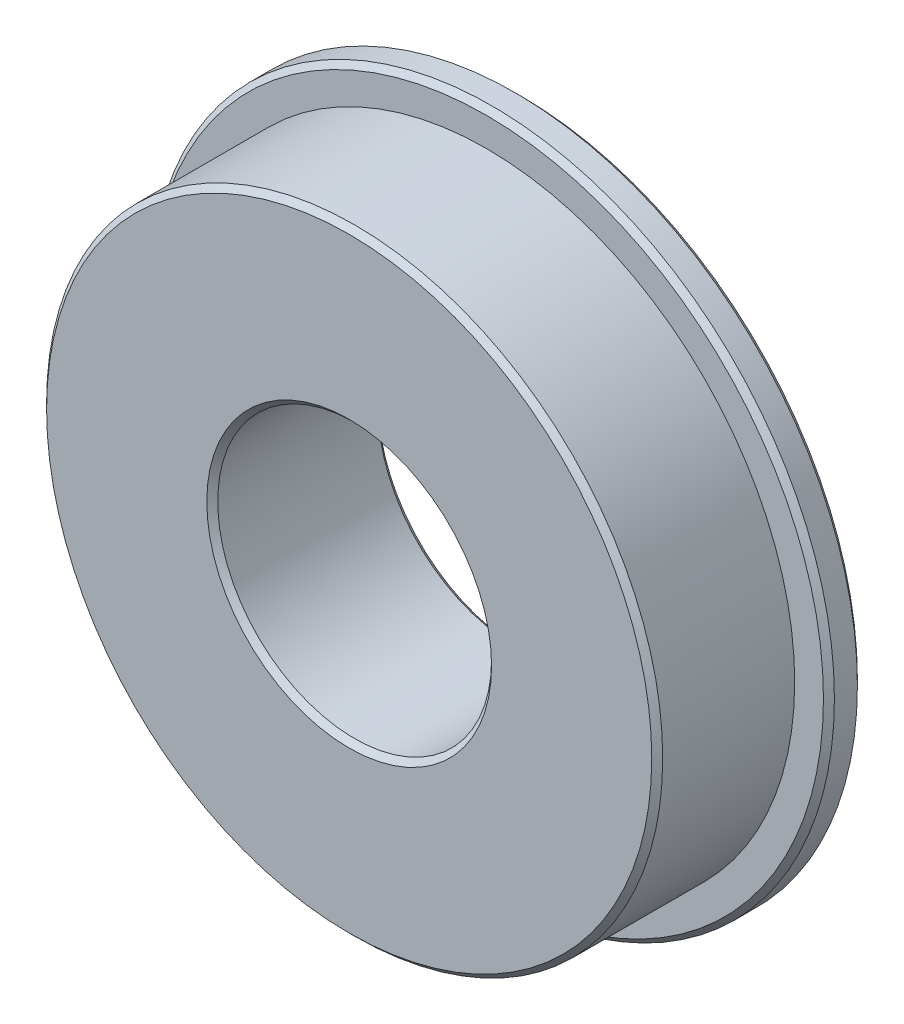
ISO-10303-21;
HEADER;
FILE_DESCRIPTION(('STEP AP214'),'2;1');
FILE_NAME('part.step','',(''),(''),'','','');
FILE_SCHEMA(('AUTOMOTIVE_DESIGN { 1 0 10303 214 1 1 1 1 }'));
ENDSEC;
DATA;
#1=APPLICATION_CONTEXT('core data for automotive mechanical design processes');
#2=APPLICATION_PROTOCOL_DEFINITION('international standard','automotive_design',2000,#1);
#3=PRODUCT_CONTEXT('',#1,'mechanical');
#4=PRODUCT('Part','Part','',(#3));
#5=PRODUCT_RELATED_PRODUCT_CATEGORY('part','',(#4));
#6=PRODUCT_DEFINITION_FORMATION('','',#4);
#7=PRODUCT_DEFINITION_CONTEXT('part definition',#1,'design');
#8=PRODUCT_DEFINITION('design','',#6,#7);
#9=PRODUCT_DEFINITION_SHAPE('','',#8);
#10=(LENGTH_UNIT() NAMED_UNIT(*) SI_UNIT(.MILLI.,.METRE.));
#11=(NAMED_UNIT(*) PLANE_ANGLE_UNIT() SI_UNIT($,.RADIAN.));
#12=(NAMED_UNIT(*) SI_UNIT($,.STERADIAN.) SOLID_ANGLE_UNIT());
#13=UNCERTAINTY_MEASURE_WITH_UNIT(LENGTH_MEASURE(1.E-05),#10,'distance_accuracy_value','');
#14=(GEOMETRIC_REPRESENTATION_CONTEXT(3) GLOBAL_UNCERTAINTY_ASSIGNED_CONTEXT((#13)) GLOBAL_UNIT_ASSIGNED_CONTEXT((#10,
#11,#12)) REPRESENTATION_CONTEXT('',''));
#15=CARTESIAN_POINT('',(0.,0.,0.));
#16=DIRECTION('',(0.,0.,1.));
#17=DIRECTION('',(1.,0.,0.));
#18=AXIS2_PLACEMENT_3D('',#15,#16,#17);
#19=CARTESIAN_POINT('',(-8.86153846153846,6.04195804195805,-3.41629999999996));
#20=DIRECTION('',(0.,0.,-1.));
#21=DIRECTION('',(0.,-1.,0.));
#22=AXIS2_PLACEMENT_3D('',#19,#20,#21);
#23=CONICAL_SURFACE('',#22,25.4,0.78539816339745);
#24=CARTESIAN_POINT('',(-8.86153846153846,6.04195804195805,7.95019999999999));
#25=DIRECTION('',(0.,0.,1.));
#26=DIRECTION('',(1.,0.,0.));
#27=AXIS2_PLACEMENT_3D('',#24,#25,#26);
#28=CIRCLE('',#27,14.0335);
#29=CARTESIAN_POINT('',(5.17196153846154,6.04195804195805,7.95019999999999));
#30=VERTEX_POINT('',#29);
#31=EDGE_CURVE('E31',#30,#30,#28,.T.);
#32=ORIENTED_EDGE('',*,*,#31,.F.);
#33=EDGE_LOOP('',(#32));
#34=FACE_BOUND('',#33,.T.);
#35=CARTESIAN_POINT('',(-8.86153846153846,6.04195804195805,7.69619999999999));
#36=DIRECTION('',(0.,0.,-1.));
#37=DIRECTION('',(0.,-1.,0.));
#38=AXIS2_PLACEMENT_3D('',#35,#36,#37);
#39=CIRCLE('',#38,14.2875);
#40=CARTESIAN_POINT('',(-8.86153846153846,-8.24554195804196,7.69619999999999));
#41=VERTEX_POINT('',#40);
#42=EDGE_CURVE('E10',#41,#41,#39,.T.);
#43=ORIENTED_EDGE('',*,*,#42,.F.);
#44=EDGE_LOOP('',(#43));
#45=FACE_BOUND('',#44,.T.);
#46=ADVANCED_FACE('F14',(#34,#45),#23,.T.);
#47=CARTESIAN_POINT('',(-8.86153846153846,6.04195804195805,-8.20419999999995));
#48=DIRECTION('',(0.,0.,-1.));
#49=DIRECTION('',(0.,-1.,0.));
#50=AXIS2_PLACEMENT_3D('',#47,#48,#49);
#51=CONICAL_SURFACE('',#50,25.4,0.78539816339745);
#52=CARTESIAN_POINT('',(-8.86153846153846,6.04195804195805,1.57479999999999));
#53=DIRECTION('',(0.,0.,1.));
#54=DIRECTION('',(1.,0.,0.));
#55=AXIS2_PLACEMENT_3D('',#52,#53,#54);
#56=CIRCLE('',#55,15.621);
#57=CARTESIAN_POINT('',(6.75946153846154,6.04195804195805,1.57479999999999));
#58=VERTEX_POINT('',#57);
#59=EDGE_CURVE('E32',#58,#58,#56,.T.);
#60=ORIENTED_EDGE('',*,*,#59,.F.);
#61=EDGE_LOOP('',(#60));
#62=FACE_BOUND('',#61,.T.);
#63=CARTESIAN_POINT('',(-8.86153846153846,6.04195804195805,1.32080000000001));
#64=DIRECTION('',(0.,0.,-1.));
#65=DIRECTION('',(0.,-1.,0.));
#66=AXIS2_PLACEMENT_3D('',#63,#64,#65);
#67=CIRCLE('',#66,15.875);
#68=CARTESIAN_POINT('',(-8.86153846153846,-9.83304195804195,1.32080000000001));
#69=VERTEX_POINT('',#68);
#70=EDGE_CURVE('E27',#69,#69,#67,.T.);
#71=ORIENTED_EDGE('',*,*,#70,.F.);
#72=EDGE_LOOP('',(#71));
#73=FACE_BOUND('',#72,.T.);
#74=ADVANCED_FACE('F75',(#62,#73),#51,.T.);
#75=CARTESIAN_POINT('',(-8.86153846153846,6.04195804195805,9.77899999999996));
#76=DIRECTION('',(0.,0.,1.));
#77=DIRECTION('',(1.,0.,0.));
#78=AXIS2_PLACEMENT_3D('',#75,#76,#77);
#79=CONICAL_SURFACE('',#78,25.4,0.78539816339745);
#80=CARTESIAN_POINT('',(-8.86153846153846,6.04195804195805,0.));
#81=DIRECTION('',(0.,0.,-1.));
#82=DIRECTION('',(0.,-1.,0.));
#83=AXIS2_PLACEMENT_3D('',#80,#81,#82);
#84=CIRCLE('',#83,15.621);
#85=CARTESIAN_POINT('',(-8.86153846153846,-9.57904195804195,0.));
#86=VERTEX_POINT('',#85);
#87=EDGE_CURVE('E39',#86,#86,#84,.T.);
#88=ORIENTED_EDGE('',*,*,#87,.F.);
#89=EDGE_LOOP('',(#88));
#90=FACE_BOUND('',#89,.T.);
#91=CARTESIAN_POINT('',(-8.86153846153846,6.04195804195805,0.254000000000004));
#92=DIRECTION('',(0.,0.,1.));
#93=DIRECTION('',(1.,0.,0.));
#94=AXIS2_PLACEMENT_3D('',#91,#92,#93);
#95=CIRCLE('',#94,15.875);
#96=CARTESIAN_POINT('',(7.01346153846154,6.04195804195805,0.254000000000004));
#97=VERTEX_POINT('',#96);
#98=EDGE_CURVE('E22',#97,#97,#95,.T.);
#99=ORIENTED_EDGE('',*,*,#98,.F.);
#100=EDGE_LOOP('',(#99));
#101=FACE_BOUND('',#100,.T.);
#102=ADVANCED_FACE('F81',(#90,#101),#79,.T.);
#103=CARTESIAN_POINT('',(-8.86153846153846,6.04195804195805,-18.796));
#104=DIRECTION('',(0.,0.,-1.));
#105=DIRECTION('',(0.,-1.,0.));
#106=AXIS2_PLACEMENT_3D('',#103,#104,#105);
#107=CONICAL_SURFACE('',#106,25.4,0.785398163397447);
#108=CARTESIAN_POINT('',(-8.86153846153846,6.04195804195805,0.254000000000004));
#109=DIRECTION('',(0.,0.,-1.));
#110=DIRECTION('',(0.,-1.,0.));
#111=AXIS2_PLACEMENT_3D('',#108,#109,#110);
#112=CIRCLE('',#111,6.35);
#113=CARTESIAN_POINT('',(-8.86153846153846,-0.308041958041952,0.254000000000004));
#114=VERTEX_POINT('',#113);
#115=EDGE_CURVE('E38',#114,#114,#112,.T.);
#116=ORIENTED_EDGE('',*,*,#115,.F.);
#117=EDGE_LOOP('',(#116));
#118=FACE_BOUND('',#117,.T.);
#119=CARTESIAN_POINT('',(-8.86153846153846,6.04195804195805,0.));
#120=DIRECTION('',(0.,0.,1.));
#121=DIRECTION('',(1.,0.,0.));
#122=AXIS2_PLACEMENT_3D('',#119,#120,#121);
#123=CIRCLE('',#122,6.604);
#124=CARTESIAN_POINT('',(-2.25753846153846,6.04195804195805,0.));
#125=VERTEX_POINT('',#124);
#126=EDGE_CURVE('E42',#125,#125,#123,.T.);
#127=ORIENTED_EDGE('',*,*,#126,.F.);
#128=EDGE_LOOP('',(#127));
#129=FACE_BOUND('',#128,.T.);
#130=ADVANCED_FACE('F71',(#118,#129),#107,.F.);
#131=CARTESIAN_POINT('',(-8.86153846153846,6.04195804195805,26.7462));
#132=DIRECTION('',(0.,0.,1.));
#133=DIRECTION('',(1.,0.,0.));
#134=AXIS2_PLACEMENT_3D('',#131,#132,#133);
#135=CONICAL_SURFACE('',#134,25.4,0.785398163397447);
#136=CARTESIAN_POINT('',(-8.86153846153846,6.04195804195805,7.69619999999999));
#137=DIRECTION('',(0.,0.,1.));
#138=DIRECTION('',(1.,0.,0.));
#139=AXIS2_PLACEMENT_3D('',#136,#137,#138);
#140=CIRCLE('',#139,6.35);
#141=CARTESIAN_POINT('',(-2.51153846153846,6.04195804195805,7.69619999999999));
#142=VERTEX_POINT('',#141);
#143=EDGE_CURVE('E35',#142,#142,#140,.T.);
#144=ORIENTED_EDGE('',*,*,#143,.F.);
#145=EDGE_LOOP('',(#144));
#146=FACE_BOUND('',#145,.T.);
#147=CARTESIAN_POINT('',(-8.86153846153846,6.04195804195805,7.95019999999999));
#148=DIRECTION('',(0.,0.,-1.));
#149=DIRECTION('',(0.,-1.,0.));
#150=AXIS2_PLACEMENT_3D('',#147,#148,#149);
#151=CIRCLE('',#150,6.604);
#152=CARTESIAN_POINT('',(-8.86153846153846,-0.562041958041949,7.95019999999999));
#153=VERTEX_POINT('',#152);
#154=EDGE_CURVE('E41',#153,#153,#151,.T.);
#155=ORIENTED_EDGE('',*,*,#154,.F.);
#156=EDGE_LOOP('',(#155));
#157=FACE_BOUND('',#156,.T.);
#158=ADVANCED_FACE('F63',(#146,#157),#135,.F.);
#159=CARTESIAN_POINT('',(-8.86153846153846,6.04195804195805,7.95019999999999));
#160=DIRECTION('',(0.,0.,1.));
#161=DIRECTION('',(1.,0.,0.));
#162=AXIS2_PLACEMENT_3D('',#159,#160,#161);
#163=CYLINDRICAL_SURFACE('',#162,14.2875);
#164=CARTESIAN_POINT('',(-8.86153846153846,6.04195804195805,1.57479999999999));
#165=DIRECTION('',(0.,0.,-1.));
#166=DIRECTION('',(0.,-1.,0.));
#167=AXIS2_PLACEMENT_3D('',#164,#165,#166);
#168=CIRCLE('',#167,14.2875);
#169=CARTESIAN_POINT('',(-8.86153846153846,-8.24554195804196,1.57479999999999));
#170=VERTEX_POINT('',#169);
#171=EDGE_CURVE('E18',#170,#170,#168,.T.);
#172=ORIENTED_EDGE('',*,*,#171,.F.);
#173=EDGE_LOOP('',(#172));
#174=FACE_BOUND('',#173,.T.);
#175=ORIENTED_EDGE('',*,*,#42,.T.);
#176=EDGE_LOOP('',(#175));
#177=FACE_BOUND('',#176,.T.);
#178=ADVANCED_FACE('F60',(#174,#177),#163,.T.);
#179=CARTESIAN_POINT('',(-8.86153846153846,6.04195804195805,1.57479999999999));
#180=DIRECTION('',(0.,0.,1.));
#181=DIRECTION('',(1.,0.,0.));
#182=AXIS2_PLACEMENT_3D('',#179,#180,#181);
#183=CYLINDRICAL_SURFACE('',#182,15.875);
#184=ORIENTED_EDGE('',*,*,#98,.T.);
#185=EDGE_LOOP('',(#184));
#186=FACE_BOUND('',#185,.T.);
#187=ORIENTED_EDGE('',*,*,#70,.T.);
#188=EDGE_LOOP('',(#187));
#189=FACE_BOUND('',#188,.T.);
#190=ADVANCED_FACE('F62',(#186,#189),#183,.T.);
#191=CARTESIAN_POINT('',(-8.86153846153846,6.04195804195805,1.57479999999999));
#192=DIRECTION('',(0.,0.,1.));
#193=DIRECTION('',(1.,0.,0.));
#194=AXIS2_PLACEMENT_3D('',#191,#192,#193);
#195=CYLINDRICAL_SURFACE('',#194,6.35);
#196=ORIENTED_EDGE('',*,*,#115,.T.);
#197=EDGE_LOOP('',(#196));
#198=FACE_BOUND('',#197,.T.);
#199=ORIENTED_EDGE('',*,*,#143,.T.);
#200=EDGE_LOOP('',(#199));
#201=FACE_BOUND('',#200,.T.);
#202=ADVANCED_FACE('F16',(#198,#201),#195,.F.);
#203=CARTESIAN_POINT('',(-8.86153846153846,6.04195804195805,1.57479999999999));
#204=DIRECTION('',(0.,0.,-1.));
#205=DIRECTION('',(-1.,0.,0.));
#206=AXIS2_PLACEMENT_3D('',#203,#204,#205);
#207=PLANE('',#206);
#208=ORIENTED_EDGE('',*,*,#59,.T.);
#209=EDGE_LOOP('',(#208));
#210=FACE_BOUND('',#209,.T.);
#211=ORIENTED_EDGE('',*,*,#171,.T.);
#212=EDGE_LOOP('',(#211));
#213=FACE_BOUND('',#212,.T.);
#214=ADVANCED_FACE('F58',(#210,#213),#207,.F.);
#215=CARTESIAN_POINT('',(-8.86153846153846,6.04195804195805,7.95019999999999));
#216=DIRECTION('',(0.,0.,-1.));
#217=DIRECTION('',(-1.,0.,0.));
#218=AXIS2_PLACEMENT_3D('',#215,#216,#217);
#219=PLANE('',#218);
#220=ORIENTED_EDGE('',*,*,#31,.T.);
#221=EDGE_LOOP('',(#220));
#222=FACE_BOUND('',#221,.T.);
#223=ORIENTED_EDGE('',*,*,#154,.T.);
#224=EDGE_LOOP('',(#223));
#225=FACE_BOUND('',#224,.T.);
#226=ADVANCED_FACE('F101',(#222,#225),#219,.F.);
#227=CARTESIAN_POINT('',(-8.86153846153846,6.04195804195805,0.));
#228=DIRECTION('',(0.,0.,-1.));
#229=DIRECTION('',(-1.,0.,0.));
#230=AXIS2_PLACEMENT_3D('',#227,#228,#229);
#231=PLANE('',#230);
#232=ORIENTED_EDGE('',*,*,#87,.T.);
#233=EDGE_LOOP('',(#232));
#234=FACE_BOUND('',#233,.T.);
#235=ORIENTED_EDGE('',*,*,#126,.T.);
#236=EDGE_LOOP('',(#235));
#237=FACE_BOUND('',#236,.T.);
#238=ADVANCED_FACE('F86',(#234,#237),#231,.T.);
#239=CLOSED_SHELL('',(#46,#74,#102,#130,#158,#178,#190,#202,#214,#226,#238));
#240=MANIFOLD_SOLID_BREP('B1',#239);
#241=ADVANCED_BREP_SHAPE_REPRESENTATION('',(#18,#240),#14);
#242=SHAPE_DEFINITION_REPRESENTATION(#9,#241);
ENDSEC;
END-ISO-10303-21;
